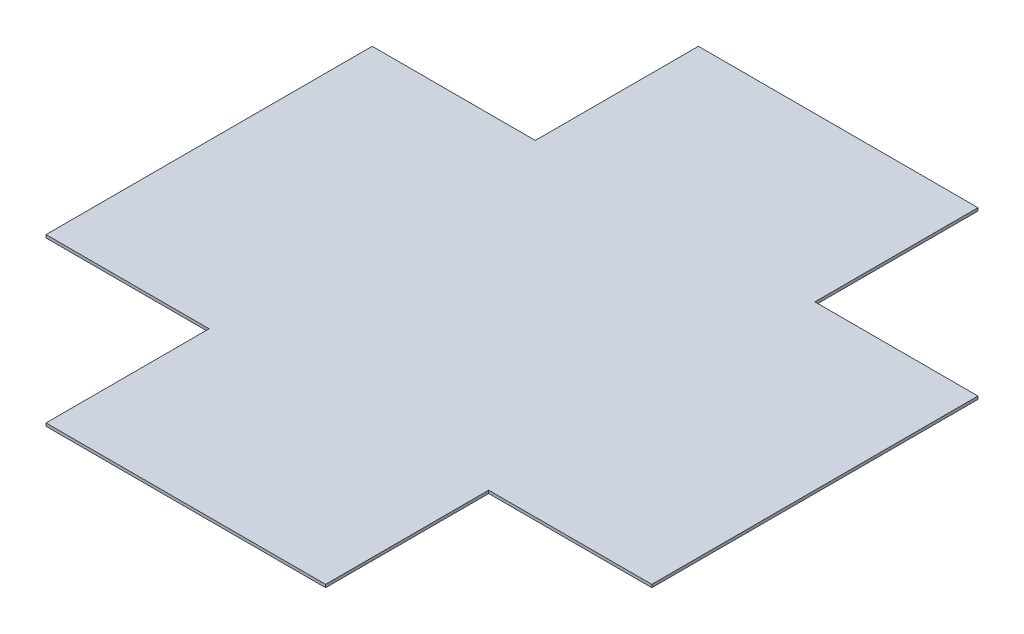
ISO-10303-21;
HEADER;
FILE_DESCRIPTION(('STEP AP214'),'2;1');
FILE_NAME('part.step','',(''),(''),'','','');
FILE_SCHEMA(('AUTOMOTIVE_DESIGN { 1 0 10303 214 1 1 1 1 }'));
ENDSEC;
DATA;
#1=APPLICATION_CONTEXT('core data for automotive mechanical design processes');
#2=APPLICATION_PROTOCOL_DEFINITION('international standard','automotive_design',2000,#1);
#3=PRODUCT_CONTEXT('',#1,'mechanical');
#4=PRODUCT('Part','Part','',(#3));
#5=PRODUCT_RELATED_PRODUCT_CATEGORY('part','',(#4));
#6=PRODUCT_DEFINITION_FORMATION('','',#4);
#7=PRODUCT_DEFINITION_CONTEXT('part definition',#1,'design');
#8=PRODUCT_DEFINITION('design','',#6,#7);
#9=PRODUCT_DEFINITION_SHAPE('','',#8);
#10=(LENGTH_UNIT() NAMED_UNIT(*) SI_UNIT(.MILLI.,.METRE.));
#11=(NAMED_UNIT(*) PLANE_ANGLE_UNIT() SI_UNIT($,.RADIAN.));
#12=(NAMED_UNIT(*) SI_UNIT($,.STERADIAN.) SOLID_ANGLE_UNIT());
#13=UNCERTAINTY_MEASURE_WITH_UNIT(LENGTH_MEASURE(1.E-05),#10,'distance_accuracy_value','');
#14=(GEOMETRIC_REPRESENTATION_CONTEXT(3) GLOBAL_UNCERTAINTY_ASSIGNED_CONTEXT((#13)) GLOBAL_UNIT_ASSIGNED_CONTEXT((#10,
#11,#12)) REPRESENTATION_CONTEXT('',''));
#15=CARTESIAN_POINT('',(0.,0.,0.));
#16=DIRECTION('',(0.,0.,1.));
#17=DIRECTION('',(1.,0.,0.));
#18=AXIS2_PLACEMENT_3D('',#15,#16,#17);
#19=CARTESIAN_POINT('',(0.,1.5875,177.8));
#20=DIRECTION('',(0.,0.,-1.));
#21=DIRECTION('',(-1.,0.,0.));
#22=AXIS2_PLACEMENT_3D('',#19,#20,#21);
#23=PLANE('',#22);
#24=DIRECTION('',(1.,0.,0.));
#25=VECTOR('',#24,1.);
#26=CARTESIAN_POINT('',(0.,-1.5875,177.8));
#27=LINE('',#26,#25);
#28=CARTESIAN_POINT('',(-330.2,-1.5875,177.8));
#29=VERTEX_POINT('',#28);
#30=CARTESIAN_POINT('',(-152.4,-1.5875,177.8));
#31=VERTEX_POINT('',#30);
#32=EDGE_CURVE('E163',#29,#31,#27,.T.);
#33=ORIENTED_EDGE('',*,*,#32,.T.);
#34=DIRECTION('',(0.,-1.,0.));
#35=VECTOR('',#34,1.);
#36=CARTESIAN_POINT('',(-152.4,1.5875,177.8));
#37=LINE('',#36,#35);
#38=CARTESIAN_POINT('',(-152.4,1.5875,177.8));
#39=VERTEX_POINT('',#38);
#40=EDGE_CURVE('E11',#39,#31,#37,.T.);
#41=ORIENTED_EDGE('',*,*,#40,.F.);
#42=DIRECTION('',(1.,0.,0.));
#43=VECTOR('',#42,1.);
#44=CARTESIAN_POINT('',(0.,1.5875,177.8));
#45=LINE('',#44,#43);
#46=CARTESIAN_POINT('',(-330.2,1.5875,177.8));
#47=VERTEX_POINT('',#46);
#48=EDGE_CURVE('E106',#47,#39,#45,.T.);
#49=ORIENTED_EDGE('',*,*,#48,.F.);
#50=DIRECTION('',(0.,-1.,0.));
#51=VECTOR('',#50,1.);
#52=CARTESIAN_POINT('',(-330.2,1.5875,177.8));
#53=LINE('',#52,#51);
#54=EDGE_CURVE('E159',#47,#29,#53,.T.);
#55=ORIENTED_EDGE('',*,*,#54,.T.);
#56=EDGE_LOOP('',(#33,#41,#49,#55));
#57=FACE_BOUND('',#56,.T.);
#58=ADVANCED_FACE('F41',(#57),#23,.F.);
#59=CARTESIAN_POINT('',(-152.4,1.5875,0.));
#60=DIRECTION('',(-1.,0.,0.));
#61=DIRECTION('',(0.,0.,1.));
#62=AXIS2_PLACEMENT_3D('',#59,#60,#61);
#63=PLANE('',#62);
#64=DIRECTION('',(0.,0.,-1.));
#65=VECTOR('',#64,1.);
#66=CARTESIAN_POINT('',(-152.4,-1.5875,0.));
#67=LINE('',#66,#65);
#68=CARTESIAN_POINT('',(-152.4,-1.5875,355.6));
#69=VERTEX_POINT('',#68);
#70=EDGE_CURVE('E167',#69,#31,#67,.T.);
#71=ORIENTED_EDGE('',*,*,#70,.F.);
#72=DIRECTION('',(0.,-1.,0.));
#73=VECTOR('',#72,1.);
#74=CARTESIAN_POINT('',(-152.4,1.5875,355.6));
#75=LINE('',#74,#73);
#76=CARTESIAN_POINT('',(-152.4,1.5875,355.6));
#77=VERTEX_POINT('',#76);
#78=EDGE_CURVE('E50',#77,#69,#75,.T.);
#79=ORIENTED_EDGE('',*,*,#78,.F.);
#80=DIRECTION('',(0.,0.,-1.));
#81=VECTOR('',#80,1.);
#82=CARTESIAN_POINT('',(-152.4,1.5875,0.));
#83=LINE('',#82,#81);
#84=EDGE_CURVE('E419',#77,#39,#83,.T.);
#85=ORIENTED_EDGE('',*,*,#84,.T.);
#86=ORIENTED_EDGE('',*,*,#40,.T.);
#87=EDGE_LOOP('',(#71,#79,#85,#86));
#88=FACE_BOUND('',#87,.T.);
#89=ADVANCED_FACE('F239',(#88),#63,.T.);
#90=CARTESIAN_POINT('',(1.29526019539602E-13,1.5875,355.6));
#91=DIRECTION('',(0.,0.,1.));
#92=DIRECTION('',(1.,0.,0.));
#93=AXIS2_PLACEMENT_3D('',#90,#91,#92);
#94=PLANE('',#93);
#95=DIRECTION('',(-1.,0.,0.));
#96=VECTOR('',#95,1.);
#97=CARTESIAN_POINT('',(1.29526019539602E-13,-1.5875,355.6));
#98=LINE('',#97,#96);
#99=CARTESIAN_POINT('',(152.4,-1.5875,355.6));
#100=VERTEX_POINT('',#99);
#101=EDGE_CURVE('E171',#100,#69,#98,.T.);
#102=ORIENTED_EDGE('',*,*,#101,.F.);
#103=DIRECTION('',(0.,-1.,0.));
#104=VECTOR('',#103,1.);
#105=CARTESIAN_POINT('',(152.4,1.5875,355.6));
#106=LINE('',#105,#104);
#107=CARTESIAN_POINT('',(152.4,1.5875,355.6));
#108=VERTEX_POINT('',#107);
#109=EDGE_CURVE('E227',#108,#100,#106,.T.);
#110=ORIENTED_EDGE('',*,*,#109,.F.);
#111=DIRECTION('',(-1.,0.,0.));
#112=VECTOR('',#111,1.);
#113=CARTESIAN_POINT('',(1.29526019539602E-13,1.5875,355.6));
#114=LINE('',#113,#112);
#115=EDGE_CURVE('E236',#108,#77,#114,.T.);
#116=ORIENTED_EDGE('',*,*,#115,.T.);
#117=ORIENTED_EDGE('',*,*,#78,.T.);
#118=EDGE_LOOP('',(#102,#110,#116,#117));
#119=FACE_BOUND('',#118,.T.);
#120=ADVANCED_FACE('F234',(#119),#94,.T.);
#121=CARTESIAN_POINT('',(152.4,1.5875,0.));
#122=DIRECTION('',(-1.,0.,0.));
#123=DIRECTION('',(0.,0.,1.));
#124=AXIS2_PLACEMENT_3D('',#121,#122,#123);
#125=PLANE('',#124);
#126=DIRECTION('',(0.,0.,-1.));
#127=VECTOR('',#126,1.);
#128=CARTESIAN_POINT('',(152.4,-1.5875,0.));
#129=LINE('',#128,#127);
#130=CARTESIAN_POINT('',(152.4,-1.5875,177.8));
#131=VERTEX_POINT('',#130);
#132=EDGE_CURVE('E175',#100,#131,#129,.T.);
#133=ORIENTED_EDGE('',*,*,#132,.T.);
#134=DIRECTION('',(0.,-1.,0.));
#135=VECTOR('',#134,1.);
#136=CARTESIAN_POINT('',(152.4,1.5875,177.8));
#137=LINE('',#136,#135);
#138=CARTESIAN_POINT('',(152.4,1.5875,177.8));
#139=VERTEX_POINT('',#138);
#140=EDGE_CURVE('E223',#139,#131,#137,.T.);
#141=ORIENTED_EDGE('',*,*,#140,.F.);
#142=DIRECTION('',(0.,0.,-1.));
#143=VECTOR('',#142,1.);
#144=CARTESIAN_POINT('',(152.4,1.5875,0.));
#145=LINE('',#144,#143);
#146=EDGE_CURVE('E258',#108,#139,#145,.T.);
#147=ORIENTED_EDGE('',*,*,#146,.F.);
#148=ORIENTED_EDGE('',*,*,#109,.T.);
#149=EDGE_LOOP('',(#133,#141,#147,#148));
#150=FACE_BOUND('',#149,.T.);
#151=ADVANCED_FACE('F247',(#150),#125,.F.);
#152=CARTESIAN_POINT('',(0.,1.5875,177.8));
#153=DIRECTION('',(0.,0.,-1.));
#154=DIRECTION('',(-1.,0.,0.));
#155=AXIS2_PLACEMENT_3D('',#152,#153,#154);
#156=PLANE('',#155);
#157=DIRECTION('',(1.,0.,0.));
#158=VECTOR('',#157,1.);
#159=CARTESIAN_POINT('',(0.,-1.5875,177.8));
#160=LINE('',#159,#158);
#161=CARTESIAN_POINT('',(330.2,-1.5875,177.8));
#162=VERTEX_POINT('',#161);
#163=EDGE_CURVE('E178',#131,#162,#160,.T.);
#164=ORIENTED_EDGE('',*,*,#163,.T.);
#165=DIRECTION('',(0.,-1.,0.));
#166=VECTOR('',#165,1.);
#167=CARTESIAN_POINT('',(330.2,1.5875,177.8));
#168=LINE('',#167,#166);
#169=CARTESIAN_POINT('',(330.2,1.5875,177.8));
#170=VERTEX_POINT('',#169);
#171=EDGE_CURVE('E220',#170,#162,#168,.T.);
#172=ORIENTED_EDGE('',*,*,#171,.F.);
#173=DIRECTION('',(1.,0.,0.));
#174=VECTOR('',#173,1.);
#175=CARTESIAN_POINT('',(0.,1.5875,177.8));
#176=LINE('',#175,#174);
#177=EDGE_CURVE('E253',#139,#170,#176,.T.);
#178=ORIENTED_EDGE('',*,*,#177,.F.);
#179=ORIENTED_EDGE('',*,*,#140,.T.);
#180=EDGE_LOOP('',(#164,#172,#178,#179));
#181=FACE_BOUND('',#180,.T.);
#182=ADVANCED_FACE('F251',(#181),#156,.F.);
#183=CARTESIAN_POINT('',(330.2,1.5875,0.));
#184=DIRECTION('',(1.,0.,0.));
#185=DIRECTION('',(0.,0.,-1.));
#186=AXIS2_PLACEMENT_3D('',#183,#184,#185);
#187=PLANE('',#186);
#188=DIRECTION('',(0.,0.,1.));
#189=VECTOR('',#188,1.);
#190=CARTESIAN_POINT('',(330.2,-1.5875,0.));
#191=LINE('',#190,#189);
#192=CARTESIAN_POINT('',(330.2,-1.5875,-177.8));
#193=VERTEX_POINT('',#192);
#194=EDGE_CURVE('E182',#193,#162,#191,.T.);
#195=ORIENTED_EDGE('',*,*,#194,.F.);
#196=DIRECTION('',(0.,-1.,0.));
#197=VECTOR('',#196,1.);
#198=CARTESIAN_POINT('',(330.2,1.5875,-177.8));
#199=LINE('',#198,#197);
#200=CARTESIAN_POINT('',(330.2,1.5875,-177.8));
#201=VERTEX_POINT('',#200);
#202=EDGE_CURVE('E217',#201,#193,#199,.T.);
#203=ORIENTED_EDGE('',*,*,#202,.F.);
#204=DIRECTION('',(0.,0.,1.));
#205=VECTOR('',#204,1.);
#206=CARTESIAN_POINT('',(330.2,1.5875,0.));
#207=LINE('',#206,#205);
#208=EDGE_CURVE('E257',#201,#170,#207,.T.);
#209=ORIENTED_EDGE('',*,*,#208,.T.);
#210=ORIENTED_EDGE('',*,*,#171,.T.);
#211=EDGE_LOOP('',(#195,#203,#209,#210));
#212=FACE_BOUND('',#211,.T.);
#213=ADVANCED_FACE('F306',(#212),#187,.T.);
#214=CARTESIAN_POINT('',(0.,1.5875,-177.8));
#215=DIRECTION('',(0.,0.,-1.));
#216=DIRECTION('',(-1.,0.,0.));
#217=AXIS2_PLACEMENT_3D('',#214,#215,#216);
#218=PLANE('',#217);
#219=DIRECTION('',(1.,0.,0.));
#220=VECTOR('',#219,1.);
#221=CARTESIAN_POINT('',(0.,-1.5875,-177.8));
#222=LINE('',#221,#220);
#223=CARTESIAN_POINT('',(152.4,-1.5875,-177.8));
#224=VERTEX_POINT('',#223);
#225=EDGE_CURVE('E186',#224,#193,#222,.T.);
#226=ORIENTED_EDGE('',*,*,#225,.F.);
#227=DIRECTION('',(0.,-1.,0.));
#228=VECTOR('',#227,1.);
#229=CARTESIAN_POINT('',(152.4,1.5875,-177.8));
#230=LINE('',#229,#228);
#231=CARTESIAN_POINT('',(152.4,1.5875,-177.8));
#232=VERTEX_POINT('',#231);
#233=EDGE_CURVE('E214',#232,#224,#230,.T.);
#234=ORIENTED_EDGE('',*,*,#233,.F.);
#235=DIRECTION('',(1.,0.,0.));
#236=VECTOR('',#235,1.);
#237=CARTESIAN_POINT('',(0.,1.5875,-177.8));
#238=LINE('',#237,#236);
#239=EDGE_CURVE('E262',#232,#201,#238,.T.);
#240=ORIENTED_EDGE('',*,*,#239,.T.);
#241=ORIENTED_EDGE('',*,*,#202,.T.);
#242=EDGE_LOOP('',(#226,#234,#240,#241));
#243=FACE_BOUND('',#242,.T.);
#244=ADVANCED_FACE('F309',(#243),#218,.T.);
#245=CARTESIAN_POINT('',(152.4,1.5875,0.));
#246=DIRECTION('',(-1.,0.,0.));
#247=DIRECTION('',(0.,0.,1.));
#248=AXIS2_PLACEMENT_3D('',#245,#246,#247);
#249=PLANE('',#248);
#250=DIRECTION('',(0.,0.,-1.));
#251=VECTOR('',#250,1.);
#252=CARTESIAN_POINT('',(152.4,-1.5875,0.));
#253=LINE('',#252,#251);
#254=CARTESIAN_POINT('',(152.4,-1.5875,-355.6));
#255=VERTEX_POINT('',#254);
#256=EDGE_CURVE('E190',#224,#255,#253,.T.);
#257=ORIENTED_EDGE('',*,*,#256,.T.);
#258=DIRECTION('',(0.,-1.,0.));
#259=VECTOR('',#258,1.);
#260=CARTESIAN_POINT('',(152.4,1.5875,-355.6));
#261=LINE('',#260,#259);
#262=CARTESIAN_POINT('',(152.4,1.5875,-355.6));
#263=VERTEX_POINT('',#262);
#264=EDGE_CURVE('E210',#263,#255,#261,.T.);
#265=ORIENTED_EDGE('',*,*,#264,.F.);
#266=DIRECTION('',(0.,0.,-1.));
#267=VECTOR('',#266,1.);
#268=CARTESIAN_POINT('',(152.4,1.5875,0.));
#269=LINE('',#268,#267);
#270=EDGE_CURVE('E270',#232,#263,#269,.T.);
#271=ORIENTED_EDGE('',*,*,#270,.F.);
#272=ORIENTED_EDGE('',*,*,#233,.T.);
#273=EDGE_LOOP('',(#257,#265,#271,#272));
#274=FACE_BOUND('',#273,.T.);
#275=ADVANCED_FACE('F277',(#274),#249,.F.);
#276=CARTESIAN_POINT('',(0.,1.5875,-355.6));
#277=DIRECTION('',(0.,0.,1.));
#278=DIRECTION('',(1.,0.,0.));
#279=AXIS2_PLACEMENT_3D('',#276,#277,#278);
#280=PLANE('',#279);
#281=DIRECTION('',(-1.,0.,0.));
#282=VECTOR('',#281,1.);
#283=CARTESIAN_POINT('',(0.,-1.5875,-355.6));
#284=LINE('',#283,#282);
#285=CARTESIAN_POINT('',(-152.4,-1.5875,-355.6));
#286=VERTEX_POINT('',#285);
#287=EDGE_CURVE('E193',#255,#286,#284,.T.);
#288=ORIENTED_EDGE('',*,*,#287,.T.);
#289=DIRECTION('',(0.,-1.,0.));
#290=VECTOR('',#289,1.);
#291=CARTESIAN_POINT('',(-152.4,1.5875,-355.6));
#292=LINE('',#291,#290);
#293=CARTESIAN_POINT('',(-152.4,1.5875,-355.6));
#294=VERTEX_POINT('',#293);
#295=EDGE_CURVE('E146',#294,#286,#292,.T.);
#296=ORIENTED_EDGE('',*,*,#295,.F.);
#297=DIRECTION('',(-1.,0.,0.));
#298=VECTOR('',#297,1.);
#299=CARTESIAN_POINT('',(0.,1.5875,-355.6));
#300=LINE('',#299,#298);
#301=EDGE_CURVE('E151',#263,#294,#300,.T.);
#302=ORIENTED_EDGE('',*,*,#301,.F.);
#303=ORIENTED_EDGE('',*,*,#264,.T.);
#304=EDGE_LOOP('',(#288,#296,#302,#303));
#305=FACE_BOUND('',#304,.T.);
#306=ADVANCED_FACE('F281',(#305),#280,.F.);
#307=CARTESIAN_POINT('',(-152.4,1.5875,0.));
#308=DIRECTION('',(-1.,0.,0.));
#309=DIRECTION('',(0.,0.,1.));
#310=AXIS2_PLACEMENT_3D('',#307,#308,#309);
#311=PLANE('',#310);
#312=DIRECTION('',(0.,0.,-1.));
#313=VECTOR('',#312,1.);
#314=CARTESIAN_POINT('',(-152.4,-1.5875,0.));
#315=LINE('',#314,#313);
#316=CARTESIAN_POINT('',(-152.4,-1.5875,-177.8));
#317=VERTEX_POINT('',#316);
#318=EDGE_CURVE('E140',#317,#286,#315,.T.);
#319=ORIENTED_EDGE('',*,*,#318,.F.);
#320=DIRECTION('',(0.,-1.,0.));
#321=VECTOR('',#320,1.);
#322=CARTESIAN_POINT('',(-152.4,1.5875,-177.8));
#323=LINE('',#322,#321);
#324=CARTESIAN_POINT('',(-152.4,1.5875,-177.8));
#325=VERTEX_POINT('',#324);
#326=EDGE_CURVE('E135',#325,#317,#323,.T.);
#327=ORIENTED_EDGE('',*,*,#326,.F.);
#328=DIRECTION('',(0.,0.,-1.));
#329=VECTOR('',#328,1.);
#330=CARTESIAN_POINT('',(-152.4,1.5875,0.));
#331=LINE('',#330,#329);
#332=EDGE_CURVE('E138',#325,#294,#331,.T.);
#333=ORIENTED_EDGE('',*,*,#332,.T.);
#334=ORIENTED_EDGE('',*,*,#295,.T.);
#335=EDGE_LOOP('',(#319,#327,#333,#334));
#336=FACE_BOUND('',#335,.T.);
#337=ADVANCED_FACE('F137',(#336),#311,.T.);
#338=CARTESIAN_POINT('',(0.,1.5875,-177.8));
#339=DIRECTION('',(0.,0.,-1.));
#340=DIRECTION('',(-1.,0.,0.));
#341=AXIS2_PLACEMENT_3D('',#338,#339,#340);
#342=PLANE('',#341);
#343=DIRECTION('',(1.,0.,0.));
#344=VECTOR('',#343,1.);
#345=CARTESIAN_POINT('',(0.,-1.5875,-177.8));
#346=LINE('',#345,#344);
#347=CARTESIAN_POINT('',(-330.2,-1.5875,-177.8));
#348=VERTEX_POINT('',#347);
#349=EDGE_CURVE('E199',#348,#317,#346,.T.);
#350=ORIENTED_EDGE('',*,*,#349,.F.);
#351=DIRECTION('',(0.,-1.,0.));
#352=VECTOR('',#351,1.);
#353=CARTESIAN_POINT('',(-330.2,1.5875,-177.8));
#354=LINE('',#353,#352);
#355=CARTESIAN_POINT('',(-330.2,1.5875,-177.8));
#356=VERTEX_POINT('',#355);
#357=EDGE_CURVE('E97',#356,#348,#354,.T.);
#358=ORIENTED_EDGE('',*,*,#357,.F.);
#359=DIRECTION('',(1.,0.,0.));
#360=VECTOR('',#359,1.);
#361=CARTESIAN_POINT('',(0.,1.5875,-177.8));
#362=LINE('',#361,#360);
#363=EDGE_CURVE('E149',#356,#325,#362,.T.);
#364=ORIENTED_EDGE('',*,*,#363,.T.);
#365=ORIENTED_EDGE('',*,*,#326,.T.);
#366=EDGE_LOOP('',(#350,#358,#364,#365));
#367=FACE_BOUND('',#366,.T.);
#368=ADVANCED_FACE('F155',(#367),#342,.T.);
#369=CARTESIAN_POINT('',(-330.2,1.5875,0.));
#370=DIRECTION('',(1.,0.,0.));
#371=DIRECTION('',(0.,0.,-1.));
#372=AXIS2_PLACEMENT_3D('',#369,#370,#371);
#373=PLANE('',#372);
#374=DIRECTION('',(0.,0.,1.));
#375=VECTOR('',#374,1.);
#376=CARTESIAN_POINT('',(-330.2,-1.5875,0.));
#377=LINE('',#376,#375);
#378=EDGE_CURVE('E100',#348,#29,#377,.T.);
#379=ORIENTED_EDGE('',*,*,#378,.T.);
#380=ORIENTED_EDGE('',*,*,#54,.F.);
#381=DIRECTION('',(0.,0.,1.));
#382=VECTOR('',#381,1.);
#383=CARTESIAN_POINT('',(-330.2,1.5875,0.));
#384=LINE('',#383,#382);
#385=EDGE_CURVE('E58',#356,#47,#384,.T.);
#386=ORIENTED_EDGE('',*,*,#385,.F.);
#387=ORIENTED_EDGE('',*,*,#357,.T.);
#388=EDGE_LOOP('',(#379,#380,#386,#387));
#389=FACE_BOUND('',#388,.T.);
#390=ADVANCED_FACE('F283',(#389),#373,.F.);
#391=CARTESIAN_POINT('',(0.,1.5875,0.));
#392=DIRECTION('',(0.,1.,0.));
#393=DIRECTION('',(0.,0.,1.));
#394=AXIS2_PLACEMENT_3D('',#391,#392,#393);
#395=PLANE('',#394);
#396=ORIENTED_EDGE('',*,*,#48,.T.);
#397=ORIENTED_EDGE('',*,*,#84,.F.);
#398=ORIENTED_EDGE('',*,*,#115,.F.);
#399=ORIENTED_EDGE('',*,*,#146,.T.);
#400=ORIENTED_EDGE('',*,*,#177,.T.);
#401=ORIENTED_EDGE('',*,*,#208,.F.);
#402=ORIENTED_EDGE('',*,*,#239,.F.);
#403=ORIENTED_EDGE('',*,*,#270,.T.);
#404=ORIENTED_EDGE('',*,*,#301,.T.);
#405=ORIENTED_EDGE('',*,*,#332,.F.);
#406=ORIENTED_EDGE('',*,*,#363,.F.);
#407=ORIENTED_EDGE('',*,*,#385,.T.);
#408=EDGE_LOOP('',(#396,#397,#398,#399,#400,#401,#402,#403,#404,#405,#406,#407));
#409=FACE_BOUND('',#408,.T.);
#410=ADVANCED_FACE('F148',(#409),#395,.T.);
#411=CARTESIAN_POINT('',(0.,-1.5875,0.));
#412=DIRECTION('',(0.,1.,0.));
#413=DIRECTION('',(0.,0.,1.));
#414=AXIS2_PLACEMENT_3D('',#411,#412,#413);
#415=PLANE('',#414);
#416=ORIENTED_EDGE('',*,*,#32,.F.);
#417=ORIENTED_EDGE('',*,*,#378,.F.);
#418=ORIENTED_EDGE('',*,*,#349,.T.);
#419=ORIENTED_EDGE('',*,*,#318,.T.);
#420=ORIENTED_EDGE('',*,*,#287,.F.);
#421=ORIENTED_EDGE('',*,*,#256,.F.);
#422=ORIENTED_EDGE('',*,*,#225,.T.);
#423=ORIENTED_EDGE('',*,*,#194,.T.);
#424=ORIENTED_EDGE('',*,*,#163,.F.);
#425=ORIENTED_EDGE('',*,*,#132,.F.);
#426=ORIENTED_EDGE('',*,*,#101,.T.);
#427=ORIENTED_EDGE('',*,*,#70,.T.);
#428=EDGE_LOOP('',(#416,#417,#418,#419,#420,#421,#422,#423,#424,#425,#426,#427));
#429=FACE_BOUND('',#428,.T.);
#430=ADVANCED_FACE('F243',(#429),#415,.F.);
#431=CLOSED_SHELL('',(#58,#89,#120,#151,#182,#213,#244,#275,#306,#337,#368,#390,#410,#430));
#432=MANIFOLD_SOLID_BREP('B2',#431);
#433=ADVANCED_BREP_SHAPE_REPRESENTATION('',(#18,#432),#14);
#434=SHAPE_DEFINITION_REPRESENTATION(#9,#433);
ENDSEC;
END-ISO-10303-21;
